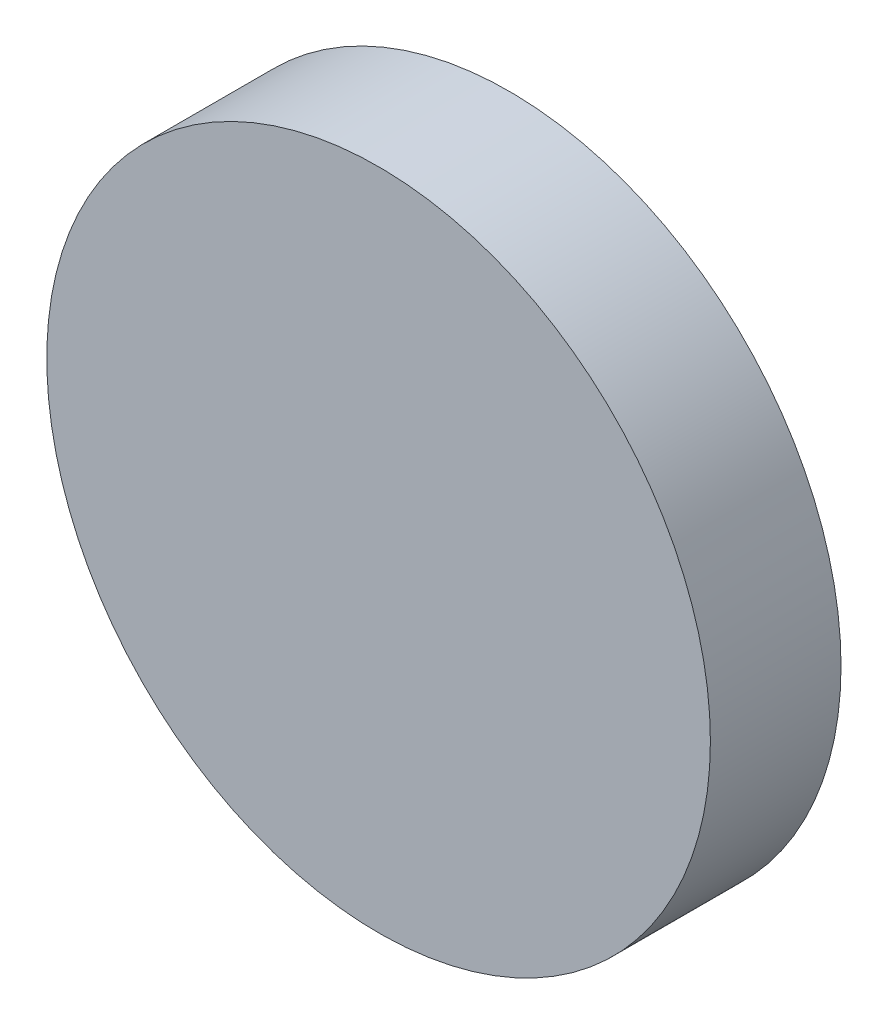
ISO-10303-21;
HEADER;
FILE_DESCRIPTION(('STEP AP214'),'2;1');
FILE_NAME('part.step','',(''),(''),'','','');
FILE_SCHEMA(('AUTOMOTIVE_DESIGN { 1 0 10303 214 1 1 1 1 }'));
ENDSEC;
DATA;
#1=APPLICATION_CONTEXT('core data for automotive mechanical design processes');
#2=APPLICATION_PROTOCOL_DEFINITION('international standard','automotive_design',2000,#1);
#3=PRODUCT_CONTEXT('',#1,'mechanical');
#4=PRODUCT('Part','Part','',(#3));
#5=PRODUCT_RELATED_PRODUCT_CATEGORY('part','',(#4));
#6=PRODUCT_DEFINITION_FORMATION('','',#4);
#7=PRODUCT_DEFINITION_CONTEXT('part definition',#1,'design');
#8=PRODUCT_DEFINITION('design','',#6,#7);
#9=PRODUCT_DEFINITION_SHAPE('','',#8);
#10=(LENGTH_UNIT() NAMED_UNIT(*) SI_UNIT(.MILLI.,.METRE.));
#11=(NAMED_UNIT(*) PLANE_ANGLE_UNIT() SI_UNIT($,.RADIAN.));
#12=(NAMED_UNIT(*) SI_UNIT($,.STERADIAN.) SOLID_ANGLE_UNIT());
#13=UNCERTAINTY_MEASURE_WITH_UNIT(LENGTH_MEASURE(1.E-05),#10,'distance_accuracy_value','');
#14=(GEOMETRIC_REPRESENTATION_CONTEXT(3) GLOBAL_UNCERTAINTY_ASSIGNED_CONTEXT((#13)) GLOBAL_UNIT_ASSIGNED_CONTEXT((#10,
#11,#12)) REPRESENTATION_CONTEXT('',''));
#15=CARTESIAN_POINT('',(0.,0.,0.));
#16=DIRECTION('',(0.,0.,1.));
#17=DIRECTION('',(1.,0.,0.));
#18=AXIS2_PLACEMENT_3D('',#15,#16,#17);
#19=CARTESIAN_POINT('',(0.,0.,0.05));
#20=DIRECTION('',(0.,0.,1.));
#21=DIRECTION('',(1.,0.,0.));
#22=AXIS2_PLACEMENT_3D('',#19,#20,#21);
#23=PLANE('',#22);
#24=CARTESIAN_POINT('',(0.8665,-1.412,0.05));
#25=DIRECTION('',(0.,0.,1.));
#26=DIRECTION('',(1.,0.,0.));
#27=AXIS2_PLACEMENT_3D('',#24,#25,#26);
#28=CIRCLE('',#27,0.1270009842482);
#29=CARTESIAN_POINT('',(0.9935009842482,-1.412,0.05));
#30=VERTEX_POINT('',#29);
#31=EDGE_CURVE('E18',#30,#30,#28,.F.);
#32=ORIENTED_EDGE('',*,*,#31,.F.);
#33=EDGE_LOOP('',(#32));
#34=FACE_BOUND('',#33,.T.);
#35=ADVANCED_FACE('F15',(#34),#23,.T.);
#36=CARTESIAN_POINT('',(0.8665,-1.412,0.));
#37=DIRECTION('',(0.,0.,1.));
#38=DIRECTION('',(1.,0.,0.));
#39=AXIS2_PLACEMENT_3D('',#36,#37,#38);
#40=CYLINDRICAL_SURFACE('',#39,0.1270009842482);
#41=ORIENTED_EDGE('',*,*,#31,.T.);
#42=EDGE_LOOP('',(#41));
#43=FACE_BOUND('',#42,.T.);
#44=CARTESIAN_POINT('',(0.8665,-1.412,0.));
#45=DIRECTION('',(0.,0.,1.));
#46=DIRECTION('',(1.,0.,0.));
#47=AXIS2_PLACEMENT_3D('',#44,#45,#46);
#48=CIRCLE('',#47,0.1270009842482);
#49=CARTESIAN_POINT('',(0.9935009842482,-1.412,0.));
#50=VERTEX_POINT('',#49);
#51=EDGE_CURVE('E10',#50,#50,#48,.T.);
#52=ORIENTED_EDGE('',*,*,#51,.T.);
#53=EDGE_LOOP('',(#52));
#54=FACE_BOUND('',#53,.T.);
#55=ADVANCED_FACE('F27',(#43,#54),#40,.T.);
#56=CARTESIAN_POINT('',(0.,0.,0.));
#57=DIRECTION('',(0.,0.,1.));
#58=DIRECTION('',(1.,0.,0.));
#59=AXIS2_PLACEMENT_3D('',#56,#57,#58);
#60=PLANE('',#59);
#61=ORIENTED_EDGE('',*,*,#51,.F.);
#62=EDGE_LOOP('',(#61));
#63=FACE_BOUND('',#62,.T.);
#64=ADVANCED_FACE('F34',(#63),#60,.F.);
#65=CLOSED_SHELL('',(#35,#55,#64));
#66=MANIFOLD_SOLID_BREP('B1',#65);
#67=ADVANCED_BREP_SHAPE_REPRESENTATION('',(#18,#66),#14);
#68=SHAPE_DEFINITION_REPRESENTATION(#9,#67);
ENDSEC;
END-ISO-10303-21;
